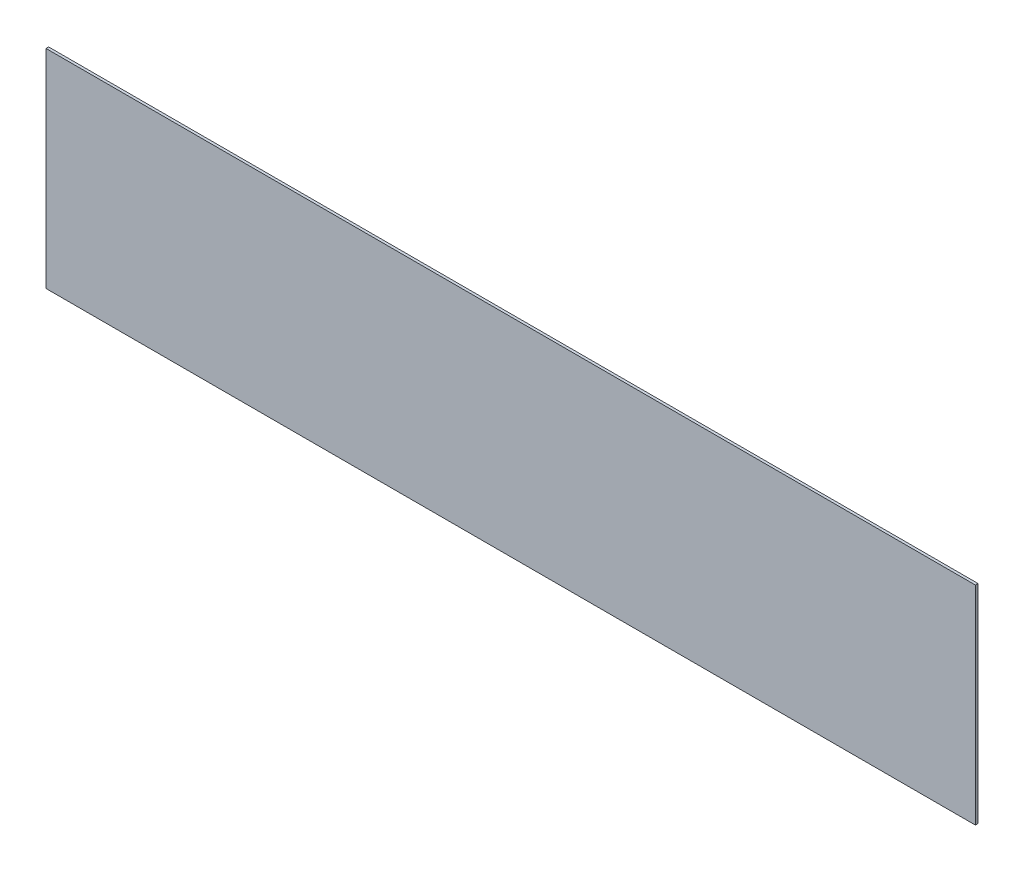
ISO-10303-21;
HEADER;
FILE_DESCRIPTION(('STEP AP214'),'2;1');
FILE_NAME('part.step','',(''),(''),'','','');
FILE_SCHEMA(('AUTOMOTIVE_DESIGN { 1 0 10303 214 1 1 1 1 }'));
ENDSEC;
DATA;
#1=APPLICATION_CONTEXT('core data for automotive mechanical design processes');
#2=APPLICATION_PROTOCOL_DEFINITION('international standard','automotive_design',2000,#1);
#3=PRODUCT_CONTEXT('',#1,'mechanical');
#4=PRODUCT('Part','Part','',(#3));
#5=PRODUCT_RELATED_PRODUCT_CATEGORY('part','',(#4));
#6=PRODUCT_DEFINITION_FORMATION('','',#4);
#7=PRODUCT_DEFINITION_CONTEXT('part definition',#1,'design');
#8=PRODUCT_DEFINITION('design','',#6,#7);
#9=PRODUCT_DEFINITION_SHAPE('','',#8);
#10=(LENGTH_UNIT() NAMED_UNIT(*) SI_UNIT(.MILLI.,.METRE.));
#11=(NAMED_UNIT(*) PLANE_ANGLE_UNIT() SI_UNIT($,.RADIAN.));
#12=(NAMED_UNIT(*) SI_UNIT($,.STERADIAN.) SOLID_ANGLE_UNIT());
#13=UNCERTAINTY_MEASURE_WITH_UNIT(LENGTH_MEASURE(1.E-05),#10,'distance_accuracy_value','');
#14=(GEOMETRIC_REPRESENTATION_CONTEXT(3) GLOBAL_UNCERTAINTY_ASSIGNED_CONTEXT((#13)) GLOBAL_UNIT_ASSIGNED_CONTEXT((#10,
#11,#12)) REPRESENTATION_CONTEXT('',''));
#15=CARTESIAN_POINT('',(0.,0.,0.));
#16=DIRECTION('',(0.,0.,1.));
#17=DIRECTION('',(1.,0.,0.));
#18=AXIS2_PLACEMENT_3D('',#15,#16,#17);
#19=CARTESIAN_POINT('',(0.,0.,1.27));
#20=DIRECTION('',(1.,0.,0.));
#21=DIRECTION('',(0.,0.,-1.));
#22=AXIS2_PLACEMENT_3D('',#19,#20,#21);
#23=PLANE('',#22);
#24=DIRECTION('',(0.,-1.,0.));
#25=VECTOR('',#24,1.);
#26=CARTESIAN_POINT('',(0.,0.,0.));
#27=LINE('',#26,#25);
#28=CARTESIAN_POINT('',(0.,100.,0.));
#29=VERTEX_POINT('',#28);
#30=CARTESIAN_POINT('',(0.,0.,0.));
#31=VERTEX_POINT('',#30);
#32=EDGE_CURVE('E102',#29,#31,#27,.T.);
#33=ORIENTED_EDGE('',*,*,#32,.T.);
#34=DIRECTION('',(0.,0.,-1.));
#35=VECTOR('',#34,1.);
#36=CARTESIAN_POINT('',(0.,0.,1.27));
#37=LINE('',#36,#35);
#38=CARTESIAN_POINT('',(0.,0.,1.27));
#39=VERTEX_POINT('',#38);
#40=EDGE_CURVE('E11',#39,#31,#37,.T.);
#41=ORIENTED_EDGE('',*,*,#40,.F.);
#42=DIRECTION('',(0.,-1.,0.));
#43=VECTOR('',#42,1.);
#44=CARTESIAN_POINT('',(0.,0.,1.27));
#45=LINE('',#44,#43);
#46=CARTESIAN_POINT('',(0.,100.,1.27));
#47=VERTEX_POINT('',#46);
#48=EDGE_CURVE('E90',#47,#39,#45,.T.);
#49=ORIENTED_EDGE('',*,*,#48,.F.);
#50=DIRECTION('',(0.,0.,-1.));
#51=VECTOR('',#50,1.);
#52=CARTESIAN_POINT('',(0.,100.,1.27));
#53=LINE('',#52,#51);
#54=EDGE_CURVE('E98',#47,#29,#53,.T.);
#55=ORIENTED_EDGE('',*,*,#54,.T.);
#56=EDGE_LOOP('',(#33,#41,#49,#55));
#57=FACE_BOUND('',#56,.T.);
#58=ADVANCED_FACE('F39',(#57),#23,.F.);
#59=CARTESIAN_POINT('',(0.,0.,1.27));
#60=DIRECTION('',(0.,1.,0.));
#61=DIRECTION('',(0.,0.,1.));
#62=AXIS2_PLACEMENT_3D('',#59,#60,#61);
#63=PLANE('',#62);
#64=DIRECTION('',(1.,0.,0.));
#65=VECTOR('',#64,1.);
#66=CARTESIAN_POINT('',(0.,0.,0.));
#67=LINE('',#66,#65);
#68=CARTESIAN_POINT('',(447.,0.,0.));
#69=VERTEX_POINT('',#68);
#70=EDGE_CURVE('E94',#31,#69,#67,.T.);
#71=ORIENTED_EDGE('',*,*,#70,.T.);
#72=DIRECTION('',(0.,0.,-1.));
#73=VECTOR('',#72,1.);
#74=CARTESIAN_POINT('',(447.,0.,1.27));
#75=LINE('',#74,#73);
#76=CARTESIAN_POINT('',(447.,0.,1.27));
#77=VERTEX_POINT('',#76);
#78=EDGE_CURVE('E47',#77,#69,#75,.T.);
#79=ORIENTED_EDGE('',*,*,#78,.F.);
#80=DIRECTION('',(1.,0.,0.));
#81=VECTOR('',#80,1.);
#82=CARTESIAN_POINT('',(0.,0.,1.27));
#83=LINE('',#82,#81);
#84=EDGE_CURVE('E85',#39,#77,#83,.T.);
#85=ORIENTED_EDGE('',*,*,#84,.F.);
#86=ORIENTED_EDGE('',*,*,#40,.T.);
#87=EDGE_LOOP('',(#71,#79,#85,#86));
#88=FACE_BOUND('',#87,.T.);
#89=ADVANCED_FACE('F93',(#88),#63,.F.);
#90=CARTESIAN_POINT('',(447.,0.,1.27));
#91=DIRECTION('',(-1.,0.,0.));
#92=DIRECTION('',(0.,0.,1.));
#93=AXIS2_PLACEMENT_3D('',#90,#91,#92);
#94=PLANE('',#93);
#95=DIRECTION('',(0.,1.,0.));
#96=VECTOR('',#95,1.);
#97=CARTESIAN_POINT('',(447.,0.,0.));
#98=LINE('',#97,#96);
#99=CARTESIAN_POINT('',(447.,100.,0.));
#100=VERTEX_POINT('',#99);
#101=EDGE_CURVE('E72',#69,#100,#98,.T.);
#102=ORIENTED_EDGE('',*,*,#101,.T.);
#103=DIRECTION('',(0.,0.,-1.));
#104=VECTOR('',#103,1.);
#105=CARTESIAN_POINT('',(447.,100.,1.27));
#106=LINE('',#105,#104);
#107=CARTESIAN_POINT('',(447.,100.,1.27));
#108=VERTEX_POINT('',#107);
#109=EDGE_CURVE('E95',#108,#100,#106,.T.);
#110=ORIENTED_EDGE('',*,*,#109,.F.);
#111=DIRECTION('',(0.,1.,0.));
#112=VECTOR('',#111,1.);
#113=CARTESIAN_POINT('',(447.,0.,1.27));
#114=LINE('',#113,#112);
#115=EDGE_CURVE('E88',#77,#108,#114,.T.);
#116=ORIENTED_EDGE('',*,*,#115,.F.);
#117=ORIENTED_EDGE('',*,*,#78,.T.);
#118=EDGE_LOOP('',(#102,#110,#116,#117));
#119=FACE_BOUND('',#118,.T.);
#120=ADVANCED_FACE('F96',(#119),#94,.F.);
#121=CARTESIAN_POINT('',(0.,100.,1.27));
#122=DIRECTION('',(0.,-1.,0.));
#123=DIRECTION('',(0.,0.,-1.));
#124=AXIS2_PLACEMENT_3D('',#121,#122,#123);
#125=PLANE('',#124);
#126=DIRECTION('',(-1.,0.,0.));
#127=VECTOR('',#126,1.);
#128=CARTESIAN_POINT('',(0.,100.,0.));
#129=LINE('',#128,#127);
#130=EDGE_CURVE('E78',#100,#29,#129,.T.);
#131=ORIENTED_EDGE('',*,*,#130,.T.);
#132=ORIENTED_EDGE('',*,*,#54,.F.);
#133=DIRECTION('',(-1.,0.,0.));
#134=VECTOR('',#133,1.);
#135=CARTESIAN_POINT('',(0.,100.,1.27));
#136=LINE('',#135,#134);
#137=EDGE_CURVE('E55',#108,#47,#136,.T.);
#138=ORIENTED_EDGE('',*,*,#137,.F.);
#139=ORIENTED_EDGE('',*,*,#109,.T.);
#140=EDGE_LOOP('',(#131,#132,#138,#139));
#141=FACE_BOUND('',#140,.T.);
#142=ADVANCED_FACE('F109',(#141),#125,.F.);
#143=CARTESIAN_POINT('',(0.,0.,1.27));
#144=DIRECTION('',(0.,0.,-1.));
#145=DIRECTION('',(-1.,0.,0.));
#146=AXIS2_PLACEMENT_3D('',#143,#144,#145);
#147=PLANE('',#146);
#148=ORIENTED_EDGE('',*,*,#48,.T.);
#149=ORIENTED_EDGE('',*,*,#84,.T.);
#150=ORIENTED_EDGE('',*,*,#115,.T.);
#151=ORIENTED_EDGE('',*,*,#137,.T.);
#152=EDGE_LOOP('',(#148,#149,#150,#151));
#153=FACE_BOUND('',#152,.T.);
#154=ADVANCED_FACE('F86',(#153),#147,.F.);
#155=CARTESIAN_POINT('',(0.,0.,0.));
#156=DIRECTION('',(0.,0.,-1.));
#157=DIRECTION('',(-1.,0.,0.));
#158=AXIS2_PLACEMENT_3D('',#155,#156,#157);
#159=PLANE('',#158);
#160=ORIENTED_EDGE('',*,*,#32,.F.);
#161=ORIENTED_EDGE('',*,*,#130,.F.);
#162=ORIENTED_EDGE('',*,*,#101,.F.);
#163=ORIENTED_EDGE('',*,*,#70,.F.);
#164=EDGE_LOOP('',(#160,#161,#162,#163));
#165=FACE_BOUND('',#164,.T.);
#166=ADVANCED_FACE('F112',(#165),#159,.T.);
#167=CLOSED_SHELL('',(#58,#89,#120,#142,#154,#166));
#168=MANIFOLD_SOLID_BREP('B2',#167);
#169=ADVANCED_BREP_SHAPE_REPRESENTATION('',(#18,#168),#14);
#170=SHAPE_DEFINITION_REPRESENTATION(#9,#169);
ENDSEC;
END-ISO-10303-21;
